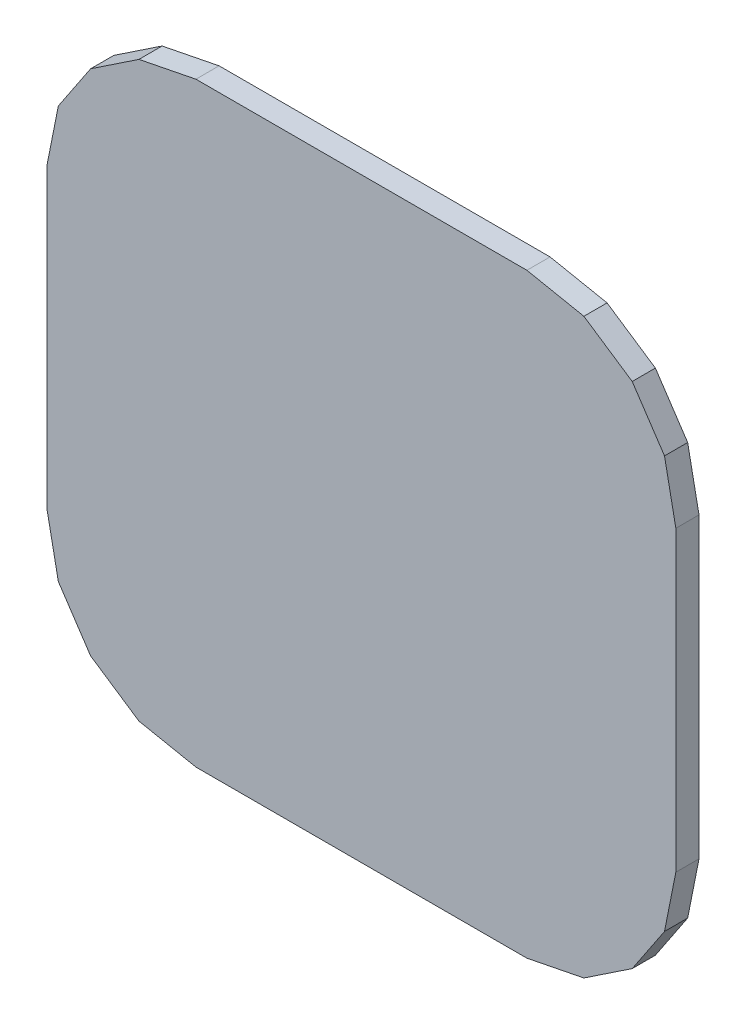
ISO-10303-21;
HEADER;
FILE_DESCRIPTION(('STEP AP214'),'2;1');
FILE_NAME('part.step','',(''),(''),'','','');
FILE_SCHEMA(('AUTOMOTIVE_DESIGN { 1 0 10303 214 1 1 1 1 }'));
ENDSEC;
DATA;
#1=APPLICATION_CONTEXT('core data for automotive mechanical design processes');
#2=APPLICATION_PROTOCOL_DEFINITION('international standard','automotive_design',2000,#1);
#3=PRODUCT_CONTEXT('',#1,'mechanical');
#4=PRODUCT('Part','Part','',(#3));
#5=PRODUCT_RELATED_PRODUCT_CATEGORY('part','',(#4));
#6=PRODUCT_DEFINITION_FORMATION('','',#4);
#7=PRODUCT_DEFINITION_CONTEXT('part definition',#1,'design');
#8=PRODUCT_DEFINITION('design','',#6,#7);
#9=PRODUCT_DEFINITION_SHAPE('','',#8);
#10=(LENGTH_UNIT() NAMED_UNIT(*) SI_UNIT(.MILLI.,.METRE.));
#11=(NAMED_UNIT(*) PLANE_ANGLE_UNIT() SI_UNIT($,.RADIAN.));
#12=(NAMED_UNIT(*) SI_UNIT($,.STERADIAN.) SOLID_ANGLE_UNIT());
#13=UNCERTAINTY_MEASURE_WITH_UNIT(LENGTH_MEASURE(1.E-05),#10,'distance_accuracy_value','');
#14=(GEOMETRIC_REPRESENTATION_CONTEXT(3) GLOBAL_UNCERTAINTY_ASSIGNED_CONTEXT((#13)) GLOBAL_UNIT_ASSIGNED_CONTEXT((#10,
#11,#12)) REPRESENTATION_CONTEXT('',''));
#15=CARTESIAN_POINT('',(0.,0.,0.));
#16=DIRECTION('',(0.,0.,1.));
#17=DIRECTION('',(1.,0.,0.));
#18=AXIS2_PLACEMENT_3D('',#15,#16,#17);
#19=CARTESIAN_POINT('',(103.855,-98.032,1.635));
#20=DIRECTION('',(0.,0.,-1.));
#21=DIRECTION('',(0.,-1.,0.));
#22=AXIS2_PLACEMENT_3D('',#19,#20,#21);
#23=PLANE('',#22);
#24=DIRECTION('',(0.980785608377497,-0.1950886731709,0.));
#25=VECTOR('',#24,1.);
#26=CARTESIAN_POINT('',(104.105,-97.582,1.635));
#27=LINE('',#26,#25);
#28=CARTESIAN_POINT('',(104.105,-97.582,1.635));
#29=VERTEX_POINT('',#28);
#30=CARTESIAN_POINT('',(104.191104,-97.599127,1.635));
#31=VERTEX_POINT('',#30);
#32=EDGE_CURVE('E20',#29,#31,#27,.T.);
#33=ORIENTED_EDGE('',*,*,#32,.F.);
#34=DIRECTION('',(1.,0.,0.));
#35=VECTOR('',#34,1.);
#36=CARTESIAN_POINT('',(103.605,-97.582,1.635));
#37=LINE('',#36,#35);
#38=CARTESIAN_POINT('',(103.605,-97.582,1.635));
#39=VERTEX_POINT('',#38);
#40=EDGE_CURVE('E351',#39,#29,#37,.T.);
#41=ORIENTED_EDGE('',*,*,#40,.F.);
#42=DIRECTION('',(0.980785608377497,0.1950886731709,0.));
#43=VECTOR('',#42,1.);
#44=CARTESIAN_POINT('',(103.518896,-97.599127,1.635));
#45=LINE('',#44,#43);
#46=CARTESIAN_POINT('',(103.518896,-97.599127,1.635));
#47=VERTEX_POINT('',#46);
#48=EDGE_CURVE('E263',#47,#39,#45,.T.);
#49=ORIENTED_EDGE('',*,*,#48,.F.);
#50=DIRECTION('',(0.831468032036157,0.555572598048105,0.));
#51=VECTOR('',#50,1.);
#52=CARTESIAN_POINT('',(103.445901,-97.647901,1.635));
#53=LINE('',#52,#51);
#54=CARTESIAN_POINT('',(103.445901,-97.647901,1.635));
#55=VERTEX_POINT('',#54);
#56=EDGE_CURVE('E338',#55,#47,#53,.T.);
#57=ORIENTED_EDGE('',*,*,#56,.F.);
#58=DIRECTION('',(0.555572598048105,0.831468032036157,0.));
#59=VECTOR('',#58,1.);
#60=CARTESIAN_POINT('',(103.397127,-97.720896,1.635));
#61=LINE('',#60,#59);
#62=CARTESIAN_POINT('',(103.397127,-97.720896,1.635));
#63=VERTEX_POINT('',#62);
#64=EDGE_CURVE('E285',#63,#55,#61,.T.);
#65=ORIENTED_EDGE('',*,*,#64,.F.);
#66=DIRECTION('',(0.1950886731709,0.980785608377497,0.));
#67=VECTOR('',#66,1.);
#68=CARTESIAN_POINT('',(103.38,-97.807,1.635));
#69=LINE('',#68,#67);
#70=CARTESIAN_POINT('',(103.38,-97.807,1.635));
#71=VERTEX_POINT('',#70);
#72=EDGE_CURVE('E326',#71,#63,#69,.T.);
#73=ORIENTED_EDGE('',*,*,#72,.F.);
#74=DIRECTION('',(0.,1.,0.));
#75=VECTOR('',#74,1.);
#76=CARTESIAN_POINT('',(103.38,-98.257,1.635));
#77=LINE('',#76,#75);
#78=CARTESIAN_POINT('',(103.38,-98.257,1.635));
#79=VERTEX_POINT('',#78);
#80=EDGE_CURVE('E311',#79,#71,#77,.T.);
#81=ORIENTED_EDGE('',*,*,#80,.F.);
#82=DIRECTION('',(-0.1950886731709,0.980785608377497,0.));
#83=VECTOR('',#82,1.);
#84=CARTESIAN_POINT('',(103.397127,-98.343104,1.635));
#85=LINE('',#84,#83);
#86=CARTESIAN_POINT('',(103.397127,-98.343104,1.635));
#87=VERTEX_POINT('',#86);
#88=EDGE_CURVE('E306',#87,#79,#85,.T.);
#89=ORIENTED_EDGE('',*,*,#88,.F.);
#90=DIRECTION('',(-0.555572598048105,0.831468032036157,0.));
#91=VECTOR('',#90,1.);
#92=CARTESIAN_POINT('',(103.445901,-98.416099,1.635));
#93=LINE('',#92,#91);
#94=CARTESIAN_POINT('',(103.445901,-98.416099,1.635));
#95=VERTEX_POINT('',#94);
#96=EDGE_CURVE('E294',#95,#87,#93,.T.);
#97=ORIENTED_EDGE('',*,*,#96,.F.);
#98=DIRECTION('',(-0.831468032036157,0.555572598048105,0.));
#99=VECTOR('',#98,1.);
#100=CARTESIAN_POINT('',(103.518896,-98.464873,1.635));
#101=LINE('',#100,#99);
#102=CARTESIAN_POINT('',(103.518896,-98.464873,1.635));
#103=VERTEX_POINT('',#102);
#104=EDGE_CURVE('E276',#103,#95,#101,.T.);
#105=ORIENTED_EDGE('',*,*,#104,.F.);
#106=DIRECTION('',(-0.980785608377497,0.1950886731709,0.));
#107=VECTOR('',#106,1.);
#108=CARTESIAN_POINT('',(103.605,-98.482,1.635));
#109=LINE('',#108,#107);
#110=CARTESIAN_POINT('',(103.605,-98.482,1.635));
#111=VERTEX_POINT('',#110);
#112=EDGE_CURVE('E267',#111,#103,#109,.T.);
#113=ORIENTED_EDGE('',*,*,#112,.F.);
#114=DIRECTION('',(-1.,0.,0.));
#115=VECTOR('',#114,1.);
#116=CARTESIAN_POINT('',(104.105,-98.482,1.635));
#117=LINE('',#116,#115);
#118=CARTESIAN_POINT('',(104.105,-98.482,1.635));
#119=VERTEX_POINT('',#118);
#120=EDGE_CURVE('E249',#119,#111,#117,.T.);
#121=ORIENTED_EDGE('',*,*,#120,.F.);
#122=DIRECTION('',(-0.980785608377497,-0.1950886731709,0.));
#123=VECTOR('',#122,1.);
#124=CARTESIAN_POINT('',(104.191104,-98.464873,1.635));
#125=LINE('',#124,#123);
#126=CARTESIAN_POINT('',(104.191104,-98.464873,1.635));
#127=VERTEX_POINT('',#126);
#128=EDGE_CURVE('E202',#127,#119,#125,.T.);
#129=ORIENTED_EDGE('',*,*,#128,.F.);
#130=DIRECTION('',(-0.831468032036157,-0.555572598048105,0.));
#131=VECTOR('',#130,1.);
#132=CARTESIAN_POINT('',(104.264099,-98.416099,1.635));
#133=LINE('',#132,#131);
#134=CARTESIAN_POINT('',(104.264099,-98.416099,1.635));
#135=VERTEX_POINT('',#134);
#136=EDGE_CURVE('E196',#135,#127,#133,.T.);
#137=ORIENTED_EDGE('',*,*,#136,.F.);
#138=DIRECTION('',(-0.555572598048105,-0.831468032036157,0.));
#139=VECTOR('',#138,1.);
#140=CARTESIAN_POINT('',(104.312873,-98.343104,1.635));
#141=LINE('',#140,#139);
#142=CARTESIAN_POINT('',(104.312873,-98.343104,1.635));
#143=VERTEX_POINT('',#142);
#144=EDGE_CURVE('E199',#143,#135,#141,.T.);
#145=ORIENTED_EDGE('',*,*,#144,.F.);
#146=DIRECTION('',(-0.1950886731709,-0.980785608377497,0.));
#147=VECTOR('',#146,1.);
#148=CARTESIAN_POINT('',(104.33,-98.257,1.635));
#149=LINE('',#148,#147);
#150=CARTESIAN_POINT('',(104.33,-98.257,1.635));
#151=VERTEX_POINT('',#150);
#152=EDGE_CURVE('E397',#151,#143,#149,.T.);
#153=ORIENTED_EDGE('',*,*,#152,.F.);
#154=DIRECTION('',(0.,-1.,0.));
#155=VECTOR('',#154,1.);
#156=CARTESIAN_POINT('',(104.33,-97.807,1.635));
#157=LINE('',#156,#155);
#158=CARTESIAN_POINT('',(104.33,-97.807,1.635));
#159=VERTEX_POINT('',#158);
#160=EDGE_CURVE('E408',#159,#151,#157,.T.);
#161=ORIENTED_EDGE('',*,*,#160,.F.);
#162=DIRECTION('',(0.1950886731709,-0.980785608377497,0.));
#163=VECTOR('',#162,1.);
#164=CARTESIAN_POINT('',(104.312873,-97.720896,1.635));
#165=LINE('',#164,#163);
#166=CARTESIAN_POINT('',(104.312873,-97.720896,1.635));
#167=VERTEX_POINT('',#166);
#168=EDGE_CURVE('E417',#167,#159,#165,.T.);
#169=ORIENTED_EDGE('',*,*,#168,.F.);
#170=DIRECTION('',(0.555572598048105,-0.831468032036157,0.));
#171=VECTOR('',#170,1.);
#172=CARTESIAN_POINT('',(104.264099,-97.647901,1.635));
#173=LINE('',#172,#171);
#174=CARTESIAN_POINT('',(104.264099,-97.647901,1.635));
#175=VERTEX_POINT('',#174);
#176=EDGE_CURVE('E370',#175,#167,#173,.T.);
#177=ORIENTED_EDGE('',*,*,#176,.F.);
#178=DIRECTION('',(0.831468032036157,-0.555572598048105,0.));
#179=VECTOR('',#178,1.);
#180=CARTESIAN_POINT('',(104.191104,-97.599127,1.635));
#181=LINE('',#180,#179);
#182=EDGE_CURVE('E368',#31,#175,#181,.T.);
#183=ORIENTED_EDGE('',*,*,#182,.F.);
#184=EDGE_LOOP('',(#33,#41,#49,#57,#65,#73,#81,#89,#97,#105,#113,#121,#129,#137,#145,#153,#161,
#169,#177,#183));
#185=FACE_BOUND('',#184,.T.);
#186=ADVANCED_FACE('F17',(#185),#23,.F.);
#187=CARTESIAN_POINT('',(103.855,-98.032,1.6));
#188=DIRECTION('',(0.,0.,-1.));
#189=DIRECTION('',(0.,-1.,0.));
#190=AXIS2_PLACEMENT_3D('',#187,#188,#189);
#191=PLANE('',#190);
#192=DIRECTION('',(0.831468032036157,-0.555572598048105,0.));
#193=VECTOR('',#192,1.);
#194=CARTESIAN_POINT('',(104.191104,-97.599127,1.6));
#195=LINE('',#194,#193);
#196=CARTESIAN_POINT('',(104.191104,-97.599127,1.6));
#197=VERTEX_POINT('',#196);
#198=CARTESIAN_POINT('',(104.264099,-97.647901,1.6));
#199=VERTEX_POINT('',#198);
#200=EDGE_CURVE('E380',#197,#199,#195,.T.);
#201=ORIENTED_EDGE('',*,*,#200,.T.);
#202=DIRECTION('',(0.555572598048105,-0.831468032036157,0.));
#203=VECTOR('',#202,1.);
#204=CARTESIAN_POINT('',(104.264099,-97.647901,1.6));
#205=LINE('',#204,#203);
#206=CARTESIAN_POINT('',(104.312873,-97.720896,1.6));
#207=VERTEX_POINT('',#206);
#208=EDGE_CURVE('E392',#199,#207,#205,.T.);
#209=ORIENTED_EDGE('',*,*,#208,.T.);
#210=DIRECTION('',(0.1950886731709,-0.980785608377497,0.));
#211=VECTOR('',#210,1.);
#212=CARTESIAN_POINT('',(104.312873,-97.720896,1.6));
#213=LINE('',#212,#211);
#214=CARTESIAN_POINT('',(104.33,-97.807,1.6));
#215=VERTEX_POINT('',#214);
#216=EDGE_CURVE('E412',#207,#215,#213,.T.);
#217=ORIENTED_EDGE('',*,*,#216,.T.);
#218=DIRECTION('',(0.,-1.,0.));
#219=VECTOR('',#218,1.);
#220=CARTESIAN_POINT('',(104.33,-97.807,1.6));
#221=LINE('',#220,#219);
#222=CARTESIAN_POINT('',(104.33,-98.257,1.6));
#223=VERTEX_POINT('',#222);
#224=EDGE_CURVE('E400',#215,#223,#221,.T.);
#225=ORIENTED_EDGE('',*,*,#224,.T.);
#226=DIRECTION('',(-0.1950886731709,-0.980785608377497,0.));
#227=VECTOR('',#226,1.);
#228=CARTESIAN_POINT('',(104.33,-98.257,1.6));
#229=LINE('',#228,#227);
#230=CARTESIAN_POINT('',(104.312873,-98.343104,1.6));
#231=VERTEX_POINT('',#230);
#232=EDGE_CURVE('E224',#223,#231,#229,.T.);
#233=ORIENTED_EDGE('',*,*,#232,.T.);
#234=DIRECTION('',(-0.555572598048105,-0.831468032036157,0.));
#235=VECTOR('',#234,1.);
#236=CARTESIAN_POINT('',(104.312873,-98.343104,1.6));
#237=LINE('',#236,#235);
#238=CARTESIAN_POINT('',(104.264099,-98.416099,1.6));
#239=VERTEX_POINT('',#238);
#240=EDGE_CURVE('E208',#231,#239,#237,.T.);
#241=ORIENTED_EDGE('',*,*,#240,.T.);
#242=DIRECTION('',(-0.831468032036157,-0.555572598048105,0.));
#243=VECTOR('',#242,1.);
#244=CARTESIAN_POINT('',(104.264099,-98.416099,1.6));
#245=LINE('',#244,#243);
#246=CARTESIAN_POINT('',(104.191104,-98.464873,1.6));
#247=VERTEX_POINT('',#246);
#248=EDGE_CURVE('E214',#239,#247,#245,.T.);
#249=ORIENTED_EDGE('',*,*,#248,.T.);
#250=DIRECTION('',(-0.980785608377497,-0.1950886731709,0.));
#251=VECTOR('',#250,1.);
#252=CARTESIAN_POINT('',(104.191104,-98.464873,1.6));
#253=LINE('',#252,#251);
#254=CARTESIAN_POINT('',(104.105,-98.482,1.6));
#255=VERTEX_POINT('',#254);
#256=EDGE_CURVE('E245',#247,#255,#253,.T.);
#257=ORIENTED_EDGE('',*,*,#256,.T.);
#258=DIRECTION('',(-1.,0.,0.));
#259=VECTOR('',#258,1.);
#260=CARTESIAN_POINT('',(104.105,-98.482,1.6));
#261=LINE('',#260,#259);
#262=CARTESIAN_POINT('',(103.605,-98.482,1.6));
#263=VERTEX_POINT('',#262);
#264=EDGE_CURVE('E257',#255,#263,#261,.T.);
#265=ORIENTED_EDGE('',*,*,#264,.T.);
#266=DIRECTION('',(-0.980785608377497,0.1950886731709,0.));
#267=VECTOR('',#266,1.);
#268=CARTESIAN_POINT('',(103.605,-98.482,1.6));
#269=LINE('',#268,#267);
#270=CARTESIAN_POINT('',(103.518896,-98.464873,1.6));
#271=VERTEX_POINT('',#270);
#272=EDGE_CURVE('E275',#263,#271,#269,.T.);
#273=ORIENTED_EDGE('',*,*,#272,.T.);
#274=DIRECTION('',(-0.831468032036157,0.555572598048105,0.));
#275=VECTOR('',#274,1.);
#276=CARTESIAN_POINT('',(103.518896,-98.464873,1.6));
#277=LINE('',#276,#275);
#278=CARTESIAN_POINT('',(103.445901,-98.416099,1.6));
#279=VERTEX_POINT('',#278);
#280=EDGE_CURVE('E289',#271,#279,#277,.T.);
#281=ORIENTED_EDGE('',*,*,#280,.T.);
#282=DIRECTION('',(-0.555572598048105,0.831468032036157,0.));
#283=VECTOR('',#282,1.);
#284=CARTESIAN_POINT('',(103.445901,-98.416099,1.6));
#285=LINE('',#284,#283);
#286=CARTESIAN_POINT('',(103.397127,-98.343104,1.6));
#287=VERTEX_POINT('',#286);
#288=EDGE_CURVE('E302',#279,#287,#285,.T.);
#289=ORIENTED_EDGE('',*,*,#288,.T.);
#290=DIRECTION('',(-0.1950886731709,0.980785608377497,0.));
#291=VECTOR('',#290,1.);
#292=CARTESIAN_POINT('',(103.397127,-98.343104,1.6));
#293=LINE('',#292,#291);
#294=CARTESIAN_POINT('',(103.38,-98.257,1.6));
#295=VERTEX_POINT('',#294);
#296=EDGE_CURVE('E307',#287,#295,#293,.T.);
#297=ORIENTED_EDGE('',*,*,#296,.T.);
#298=DIRECTION('',(0.,1.,0.));
#299=VECTOR('',#298,1.);
#300=CARTESIAN_POINT('',(103.38,-98.257,1.6));
#301=LINE('',#300,#299);
#302=CARTESIAN_POINT('',(103.38,-97.807,1.6));
#303=VERTEX_POINT('',#302);
#304=EDGE_CURVE('E317',#295,#303,#301,.T.);
#305=ORIENTED_EDGE('',*,*,#304,.T.);
#306=DIRECTION('',(0.1950886731709,0.980785608377497,0.));
#307=VECTOR('',#306,1.);
#308=CARTESIAN_POINT('',(103.38,-97.807,1.6));
#309=LINE('',#308,#307);
#310=CARTESIAN_POINT('',(103.397127,-97.720896,1.6));
#311=VERTEX_POINT('',#310);
#312=EDGE_CURVE('E281',#303,#311,#309,.T.);
#313=ORIENTED_EDGE('',*,*,#312,.T.);
#314=DIRECTION('',(0.555572598048105,0.831468032036157,0.));
#315=VECTOR('',#314,1.);
#316=CARTESIAN_POINT('',(103.397127,-97.720896,1.6));
#317=LINE('',#316,#315);
#318=CARTESIAN_POINT('',(103.445901,-97.647901,1.6));
#319=VERTEX_POINT('',#318);
#320=EDGE_CURVE('E334',#311,#319,#317,.T.);
#321=ORIENTED_EDGE('',*,*,#320,.T.);
#322=DIRECTION('',(0.831468032036157,0.555572598048105,0.));
#323=VECTOR('',#322,1.);
#324=CARTESIAN_POINT('',(103.445901,-97.647901,1.6));
#325=LINE('',#324,#323);
#326=CARTESIAN_POINT('',(103.518896,-97.599127,1.6));
#327=VERTEX_POINT('',#326);
#328=EDGE_CURVE('E318',#319,#327,#325,.T.);
#329=ORIENTED_EDGE('',*,*,#328,.T.);
#330=DIRECTION('',(0.980785608377497,0.1950886731709,0.));
#331=VECTOR('',#330,1.);
#332=CARTESIAN_POINT('',(103.518896,-97.599127,1.6));
#333=LINE('',#332,#331);
#334=CARTESIAN_POINT('',(103.605,-97.582,1.6));
#335=VERTEX_POINT('',#334);
#336=EDGE_CURVE('E262',#327,#335,#333,.T.);
#337=ORIENTED_EDGE('',*,*,#336,.T.);
#338=DIRECTION('',(1.,0.,0.));
#339=VECTOR('',#338,1.);
#340=CARTESIAN_POINT('',(103.605,-97.582,1.6));
#341=LINE('',#340,#339);
#342=CARTESIAN_POINT('',(104.105,-97.582,1.6));
#343=VERTEX_POINT('',#342);
#344=EDGE_CURVE('E354',#335,#343,#341,.T.);
#345=ORIENTED_EDGE('',*,*,#344,.T.);
#346=DIRECTION('',(0.980785608377497,-0.1950886731709,0.));
#347=VECTOR('',#346,1.);
#348=CARTESIAN_POINT('',(104.105,-97.582,1.6));
#349=LINE('',#348,#347);
#350=EDGE_CURVE('E11',#343,#197,#349,.T.);
#351=ORIENTED_EDGE('',*,*,#350,.T.);
#352=EDGE_LOOP('',(#201,#209,#217,#225,#233,#241,#249,#257,#265,#273,#281,#289,#297,#305,#313,
#321,#329,#337,#345,#351));
#353=FACE_BOUND('',#352,.T.);
#354=ADVANCED_FACE('F460',(#353),#191,.T.);
#355=CARTESIAN_POINT('',(104.105,-97.582,1.6));
#356=DIRECTION('',(0.1950886731709,0.980785608377497,0.));
#357=DIRECTION('',(0.,0.,-1.));
#358=AXIS2_PLACEMENT_3D('',#355,#356,#357);
#359=PLANE('',#358);
#360=DIRECTION('',(0.,0.,1.));
#361=VECTOR('',#360,1.);
#362=CARTESIAN_POINT('',(104.105,-97.582,1.6));
#363=LINE('',#362,#361);
#364=EDGE_CURVE('E352',#343,#29,#363,.T.);
#365=ORIENTED_EDGE('',*,*,#364,.T.);
#366=ORIENTED_EDGE('',*,*,#32,.T.);
#367=DIRECTION('',(0.,0.,1.));
#368=VECTOR('',#367,1.);
#369=CARTESIAN_POINT('',(104.191104,-97.599127,1.6));
#370=LINE('',#369,#368);
#371=EDGE_CURVE('E365',#197,#31,#370,.T.);
#372=ORIENTED_EDGE('',*,*,#371,.F.);
#373=ORIENTED_EDGE('',*,*,#350,.F.);
#374=EDGE_LOOP('',(#365,#366,#372,#373));
#375=FACE_BOUND('',#374,.T.);
#376=ADVANCED_FACE('F363',(#375),#359,.T.);
#377=CARTESIAN_POINT('',(103.605,-97.582,1.6));
#378=DIRECTION('',(0.,1.,0.));
#379=DIRECTION('',(1.,0.,0.));
#380=AXIS2_PLACEMENT_3D('',#377,#378,#379);
#381=PLANE('',#380);
#382=DIRECTION('',(0.,0.,1.));
#383=VECTOR('',#382,1.);
#384=CARTESIAN_POINT('',(103.605,-97.582,1.6));
#385=LINE('',#384,#383);
#386=EDGE_CURVE('E258',#335,#39,#385,.T.);
#387=ORIENTED_EDGE('',*,*,#386,.T.);
#388=ORIENTED_EDGE('',*,*,#40,.T.);
#389=ORIENTED_EDGE('',*,*,#364,.F.);
#390=ORIENTED_EDGE('',*,*,#344,.F.);
#391=EDGE_LOOP('',(#387,#388,#389,#390));
#392=FACE_BOUND('',#391,.T.);
#393=ADVANCED_FACE('F507',(#392),#381,.T.);
#394=CARTESIAN_POINT('',(103.518896,-97.599127,1.6));
#395=DIRECTION('',(-0.1950886731709,0.980785608377497,0.));
#396=DIRECTION('',(0.,0.,1.));
#397=AXIS2_PLACEMENT_3D('',#394,#395,#396);
#398=PLANE('',#397);
#399=DIRECTION('',(0.,0.,1.));
#400=VECTOR('',#399,1.);
#401=CARTESIAN_POINT('',(103.518896,-97.599127,1.6));
#402=LINE('',#401,#400);
#403=EDGE_CURVE('E322',#327,#47,#402,.T.);
#404=ORIENTED_EDGE('',*,*,#403,.T.);
#405=ORIENTED_EDGE('',*,*,#48,.T.);
#406=ORIENTED_EDGE('',*,*,#386,.F.);
#407=ORIENTED_EDGE('',*,*,#336,.F.);
#408=EDGE_LOOP('',(#404,#405,#406,#407));
#409=FACE_BOUND('',#408,.T.);
#410=ADVANCED_FACE('F512',(#409),#398,.T.);
#411=CARTESIAN_POINT('',(103.445901,-97.647901,1.6));
#412=DIRECTION('',(-0.555572598048105,0.831468032036157,0.));
#413=DIRECTION('',(0.,0.,1.));
#414=AXIS2_PLACEMENT_3D('',#411,#412,#413);
#415=PLANE('',#414);
#416=DIRECTION('',(0.,0.,1.));
#417=VECTOR('',#416,1.);
#418=CARTESIAN_POINT('',(103.445901,-97.647901,1.6));
#419=LINE('',#418,#417);
#420=EDGE_CURVE('E330',#319,#55,#419,.T.);
#421=ORIENTED_EDGE('',*,*,#420,.T.);
#422=ORIENTED_EDGE('',*,*,#56,.T.);
#423=ORIENTED_EDGE('',*,*,#403,.F.);
#424=ORIENTED_EDGE('',*,*,#328,.F.);
#425=EDGE_LOOP('',(#421,#422,#423,#424));
#426=FACE_BOUND('',#425,.T.);
#427=ADVANCED_FACE('F516',(#426),#415,.T.);
#428=CARTESIAN_POINT('',(103.397127,-97.720896,1.6));
#429=DIRECTION('',(-0.831468032036157,0.555572598048105,0.));
#430=DIRECTION('',(0.,0.,1.));
#431=AXIS2_PLACEMENT_3D('',#428,#429,#430);
#432=PLANE('',#431);
#433=DIRECTION('',(0.,0.,1.));
#434=VECTOR('',#433,1.);
#435=CARTESIAN_POINT('',(103.397127,-97.720896,1.6));
#436=LINE('',#435,#434);
#437=EDGE_CURVE('E286',#311,#63,#436,.T.);
#438=ORIENTED_EDGE('',*,*,#437,.T.);
#439=ORIENTED_EDGE('',*,*,#64,.T.);
#440=ORIENTED_EDGE('',*,*,#420,.F.);
#441=ORIENTED_EDGE('',*,*,#320,.F.);
#442=EDGE_LOOP('',(#438,#439,#440,#441));
#443=FACE_BOUND('',#442,.T.);
#444=ADVANCED_FACE('F520',(#443),#432,.T.);
#445=CARTESIAN_POINT('',(103.38,-97.807,1.6));
#446=DIRECTION('',(-0.980785608377497,0.1950886731709,0.));
#447=DIRECTION('',(0.,0.,1.));
#448=AXIS2_PLACEMENT_3D('',#445,#446,#447);
#449=PLANE('',#448);
#450=DIRECTION('',(0.,0.,1.));
#451=VECTOR('',#450,1.);
#452=CARTESIAN_POINT('',(103.38,-97.807,1.6));
#453=LINE('',#452,#451);
#454=EDGE_CURVE('E313',#303,#71,#453,.T.);
#455=ORIENTED_EDGE('',*,*,#454,.T.);
#456=ORIENTED_EDGE('',*,*,#72,.T.);
#457=ORIENTED_EDGE('',*,*,#437,.F.);
#458=ORIENTED_EDGE('',*,*,#312,.F.);
#459=EDGE_LOOP('',(#455,#456,#457,#458));
#460=FACE_BOUND('',#459,.T.);
#461=ADVANCED_FACE('F459',(#460),#449,.T.);
#462=CARTESIAN_POINT('',(103.38,-98.257,1.6));
#463=DIRECTION('',(-1.,0.,0.));
#464=DIRECTION('',(0.,0.,1.));
#465=AXIS2_PLACEMENT_3D('',#462,#463,#464);
#466=PLANE('',#465);
#467=DIRECTION('',(0.,0.,1.));
#468=VECTOR('',#467,1.);
#469=CARTESIAN_POINT('',(103.38,-98.257,1.6));
#470=LINE('',#469,#468);
#471=EDGE_CURVE('E312',#295,#79,#470,.T.);
#472=ORIENTED_EDGE('',*,*,#471,.T.);
#473=ORIENTED_EDGE('',*,*,#80,.T.);
#474=ORIENTED_EDGE('',*,*,#454,.F.);
#475=ORIENTED_EDGE('',*,*,#304,.F.);
#476=EDGE_LOOP('',(#472,#473,#474,#475));
#477=FACE_BOUND('',#476,.T.);
#478=ADVANCED_FACE('F452',(#477),#466,.T.);
#479=CARTESIAN_POINT('',(103.397127,-98.343104,1.6));
#480=DIRECTION('',(-0.980785608377497,-0.1950886731709,0.));
#481=DIRECTION('',(-0.1950886731709,0.980785608377497,0.));
#482=AXIS2_PLACEMENT_3D('',#479,#480,#481);
#483=PLANE('',#482);
#484=DIRECTION('',(0.,0.,1.));
#485=VECTOR('',#484,1.);
#486=CARTESIAN_POINT('',(103.397127,-98.343104,1.6));
#487=LINE('',#486,#485);
#488=EDGE_CURVE('E298',#287,#87,#487,.T.);
#489=ORIENTED_EDGE('',*,*,#488,.T.);
#490=ORIENTED_EDGE('',*,*,#88,.T.);
#491=ORIENTED_EDGE('',*,*,#471,.F.);
#492=ORIENTED_EDGE('',*,*,#296,.F.);
#493=EDGE_LOOP('',(#489,#490,#491,#492));
#494=FACE_BOUND('',#493,.T.);
#495=ADVANCED_FACE('F455',(#494),#483,.T.);
#496=CARTESIAN_POINT('',(103.445901,-98.416099,1.6));
#497=DIRECTION('',(-0.831468032036157,-0.555572598048105,0.));
#498=DIRECTION('',(-0.555572598048105,0.831468032036157,0.));
#499=AXIS2_PLACEMENT_3D('',#496,#497,#498);
#500=PLANE('',#499);
#501=DIRECTION('',(0.,0.,1.));
#502=VECTOR('',#501,1.);
#503=CARTESIAN_POINT('',(103.445901,-98.416099,1.6));
#504=LINE('',#503,#502);
#505=EDGE_CURVE('E280',#279,#95,#504,.T.);
#506=ORIENTED_EDGE('',*,*,#505,.T.);
#507=ORIENTED_EDGE('',*,*,#96,.T.);
#508=ORIENTED_EDGE('',*,*,#488,.F.);
#509=ORIENTED_EDGE('',*,*,#288,.F.);
#510=EDGE_LOOP('',(#506,#507,#508,#509));
#511=FACE_BOUND('',#510,.T.);
#512=ADVANCED_FACE('F463',(#511),#500,.T.);
#513=CARTESIAN_POINT('',(103.518896,-98.464873,1.6));
#514=DIRECTION('',(-0.555572598048105,-0.831468032036157,0.));
#515=DIRECTION('',(-0.831468032036157,0.555572598048105,0.));
#516=AXIS2_PLACEMENT_3D('',#513,#514,#515);
#517=PLANE('',#516);
#518=DIRECTION('',(0.,0.,1.));
#519=VECTOR('',#518,1.);
#520=CARTESIAN_POINT('',(103.518896,-98.464873,1.6));
#521=LINE('',#520,#519);
#522=EDGE_CURVE('E271',#271,#103,#521,.T.);
#523=ORIENTED_EDGE('',*,*,#522,.T.);
#524=ORIENTED_EDGE('',*,*,#104,.T.);
#525=ORIENTED_EDGE('',*,*,#505,.F.);
#526=ORIENTED_EDGE('',*,*,#280,.F.);
#527=EDGE_LOOP('',(#523,#524,#525,#526));
#528=FACE_BOUND('',#527,.T.);
#529=ADVANCED_FACE('F465',(#528),#517,.T.);
#530=CARTESIAN_POINT('',(103.605,-98.482,1.6));
#531=DIRECTION('',(-0.1950886731709,-0.980785608377497,0.));
#532=DIRECTION('',(-0.980785608377497,0.1950886731709,0.));
#533=AXIS2_PLACEMENT_3D('',#530,#531,#532);
#534=PLANE('',#533);
#535=DIRECTION('',(0.,0.,1.));
#536=VECTOR('',#535,1.);
#537=CARTESIAN_POINT('',(103.605,-98.482,1.6));
#538=LINE('',#537,#536);
#539=EDGE_CURVE('E253',#263,#111,#538,.T.);
#540=ORIENTED_EDGE('',*,*,#539,.T.);
#541=ORIENTED_EDGE('',*,*,#112,.T.);
#542=ORIENTED_EDGE('',*,*,#522,.F.);
#543=ORIENTED_EDGE('',*,*,#272,.F.);
#544=EDGE_LOOP('',(#540,#541,#542,#543));
#545=FACE_BOUND('',#544,.T.);
#546=ADVANCED_FACE('F469',(#545),#534,.T.);
#547=CARTESIAN_POINT('',(104.105,-98.482,1.6));
#548=DIRECTION('',(0.,-1.,0.));
#549=DIRECTION('',(0.,0.,-1.));
#550=AXIS2_PLACEMENT_3D('',#547,#548,#549);
#551=PLANE('',#550);
#552=DIRECTION('',(0.,0.,1.));
#553=VECTOR('',#552,1.);
#554=CARTESIAN_POINT('',(104.105,-98.482,1.6));
#555=LINE('',#554,#553);
#556=EDGE_CURVE('E241',#255,#119,#555,.T.);
#557=ORIENTED_EDGE('',*,*,#556,.T.);
#558=ORIENTED_EDGE('',*,*,#120,.T.);
#559=ORIENTED_EDGE('',*,*,#539,.F.);
#560=ORIENTED_EDGE('',*,*,#264,.F.);
#561=EDGE_LOOP('',(#557,#558,#559,#560));
#562=FACE_BOUND('',#561,.T.);
#563=ADVANCED_FACE('F471',(#562),#551,.T.);
#564=CARTESIAN_POINT('',(104.191104,-98.464873,1.6));
#565=DIRECTION('',(0.1950886731709,-0.980785608377497,0.));
#566=DIRECTION('',(0.,0.,-1.));
#567=AXIS2_PLACEMENT_3D('',#564,#565,#566);
#568=PLANE('',#567);
#569=DIRECTION('',(0.,0.,1.));
#570=VECTOR('',#569,1.);
#571=CARTESIAN_POINT('',(104.191104,-98.464873,1.6));
#572=LINE('',#571,#570);
#573=EDGE_CURVE('E207',#247,#127,#572,.T.);
#574=ORIENTED_EDGE('',*,*,#573,.T.);
#575=ORIENTED_EDGE('',*,*,#128,.T.);
#576=ORIENTED_EDGE('',*,*,#556,.F.);
#577=ORIENTED_EDGE('',*,*,#256,.F.);
#578=EDGE_LOOP('',(#574,#575,#576,#577));
#579=FACE_BOUND('',#578,.T.);
#580=ADVANCED_FACE('F474',(#579),#568,.T.);
#581=CARTESIAN_POINT('',(104.264099,-98.416099,1.6));
#582=DIRECTION('',(0.555572598048105,-0.831468032036157,0.));
#583=DIRECTION('',(0.,0.,-1.));
#584=AXIS2_PLACEMENT_3D('',#581,#582,#583);
#585=PLANE('',#584);
#586=DIRECTION('',(0.,0.,1.));
#587=VECTOR('',#586,1.);
#588=CARTESIAN_POINT('',(104.264099,-98.416099,1.6));
#589=LINE('',#588,#587);
#590=EDGE_CURVE('E211',#239,#135,#589,.T.);
#591=ORIENTED_EDGE('',*,*,#590,.T.);
#592=ORIENTED_EDGE('',*,*,#136,.T.);
#593=ORIENTED_EDGE('',*,*,#573,.F.);
#594=ORIENTED_EDGE('',*,*,#248,.F.);
#595=EDGE_LOOP('',(#591,#592,#593,#594));
#596=FACE_BOUND('',#595,.T.);
#597=ADVANCED_FACE('F212',(#596),#585,.T.);
#598=CARTESIAN_POINT('',(104.312873,-98.343104,1.6));
#599=DIRECTION('',(0.831468032036157,-0.555572598048105,0.));
#600=DIRECTION('',(0.,0.,-1.));
#601=AXIS2_PLACEMENT_3D('',#598,#599,#600);
#602=PLANE('',#601);
#603=DIRECTION('',(0.,0.,1.));
#604=VECTOR('',#603,1.);
#605=CARTESIAN_POINT('',(104.312873,-98.343104,1.6));
#606=LINE('',#605,#604);
#607=EDGE_CURVE('E221',#231,#143,#606,.T.);
#608=ORIENTED_EDGE('',*,*,#607,.T.);
#609=ORIENTED_EDGE('',*,*,#144,.T.);
#610=ORIENTED_EDGE('',*,*,#590,.F.);
#611=ORIENTED_EDGE('',*,*,#240,.F.);
#612=EDGE_LOOP('',(#608,#609,#610,#611));
#613=FACE_BOUND('',#612,.T.);
#614=ADVANCED_FACE('F219',(#613),#602,.T.);
#615=CARTESIAN_POINT('',(104.33,-98.257,1.6));
#616=DIRECTION('',(0.980785608377497,-0.1950886731709,0.));
#617=DIRECTION('',(0.,0.,-1.));
#618=AXIS2_PLACEMENT_3D('',#615,#616,#617);
#619=PLANE('',#618);
#620=DIRECTION('',(0.,0.,1.));
#621=VECTOR('',#620,1.);
#622=CARTESIAN_POINT('',(104.33,-98.257,1.6));
#623=LINE('',#622,#621);
#624=EDGE_CURVE('E404',#223,#151,#623,.T.);
#625=ORIENTED_EDGE('',*,*,#624,.T.);
#626=ORIENTED_EDGE('',*,*,#152,.T.);
#627=ORIENTED_EDGE('',*,*,#607,.F.);
#628=ORIENTED_EDGE('',*,*,#232,.F.);
#629=EDGE_LOOP('',(#625,#626,#627,#628));
#630=FACE_BOUND('',#629,.T.);
#631=ADVANCED_FACE('F477',(#630),#619,.T.);
#632=CARTESIAN_POINT('',(104.33,-97.807,1.6));
#633=DIRECTION('',(1.,0.,0.));
#634=DIRECTION('',(0.,1.,0.));
#635=AXIS2_PLACEMENT_3D('',#632,#633,#634);
#636=PLANE('',#635);
#637=DIRECTION('',(0.,0.,1.));
#638=VECTOR('',#637,1.);
#639=CARTESIAN_POINT('',(104.33,-97.807,1.6));
#640=LINE('',#639,#638);
#641=EDGE_CURVE('E413',#215,#159,#640,.T.);
#642=ORIENTED_EDGE('',*,*,#641,.T.);
#643=ORIENTED_EDGE('',*,*,#160,.T.);
#644=ORIENTED_EDGE('',*,*,#624,.F.);
#645=ORIENTED_EDGE('',*,*,#224,.F.);
#646=EDGE_LOOP('',(#642,#643,#644,#645));
#647=FACE_BOUND('',#646,.T.);
#648=ADVANCED_FACE('F480',(#647),#636,.T.);
#649=CARTESIAN_POINT('',(104.312873,-97.720896,1.6));
#650=DIRECTION('',(0.980785608377497,0.1950886731709,0.));
#651=DIRECTION('',(0.,0.,-1.));
#652=AXIS2_PLACEMENT_3D('',#649,#650,#651);
#653=PLANE('',#652);
#654=DIRECTION('',(0.,0.,1.));
#655=VECTOR('',#654,1.);
#656=CARTESIAN_POINT('',(104.312873,-97.720896,1.6));
#657=LINE('',#656,#655);
#658=EDGE_CURVE('E388',#207,#167,#657,.T.);
#659=ORIENTED_EDGE('',*,*,#658,.T.);
#660=ORIENTED_EDGE('',*,*,#168,.T.);
#661=ORIENTED_EDGE('',*,*,#641,.F.);
#662=ORIENTED_EDGE('',*,*,#216,.F.);
#663=EDGE_LOOP('',(#659,#660,#661,#662));
#664=FACE_BOUND('',#663,.T.);
#665=ADVANCED_FACE('F482',(#664),#653,.T.);
#666=CARTESIAN_POINT('',(104.264099,-97.647901,1.6));
#667=DIRECTION('',(0.831468032036157,0.555572598048105,0.));
#668=DIRECTION('',(0.,0.,-1.));
#669=AXIS2_PLACEMENT_3D('',#666,#667,#668);
#670=PLANE('',#669);
#671=DIRECTION('',(0.,0.,1.));
#672=VECTOR('',#671,1.);
#673=CARTESIAN_POINT('',(104.264099,-97.647901,1.6));
#674=LINE('',#673,#672);
#675=EDGE_CURVE('E375',#199,#175,#674,.T.);
#676=ORIENTED_EDGE('',*,*,#675,.T.);
#677=ORIENTED_EDGE('',*,*,#176,.T.);
#678=ORIENTED_EDGE('',*,*,#658,.F.);
#679=ORIENTED_EDGE('',*,*,#208,.F.);
#680=EDGE_LOOP('',(#676,#677,#678,#679));
#681=FACE_BOUND('',#680,.T.);
#682=ADVANCED_FACE('F485',(#681),#670,.T.);
#683=CARTESIAN_POINT('',(104.191104,-97.599127,1.6));
#684=DIRECTION('',(0.555572598048105,0.831468032036157,0.));
#685=DIRECTION('',(0.,0.,-1.));
#686=AXIS2_PLACEMENT_3D('',#683,#684,#685);
#687=PLANE('',#686);
#688=ORIENTED_EDGE('',*,*,#371,.T.);
#689=ORIENTED_EDGE('',*,*,#182,.T.);
#690=ORIENTED_EDGE('',*,*,#675,.F.);
#691=ORIENTED_EDGE('',*,*,#200,.F.);
#692=EDGE_LOOP('',(#688,#689,#690,#691));
#693=FACE_BOUND('',#692,.T.);
#694=ADVANCED_FACE('F378',(#693),#687,.T.);
#695=CLOSED_SHELL('',(#186,#354,#376,#393,#410,#427,#444,#461,#478,#495,#512,#529,#546,#563,
#580,#597,#614,#631,#648,#665,#682,#694));
#696=MANIFOLD_SOLID_BREP('B1',#695);
#697=ADVANCED_BREP_SHAPE_REPRESENTATION('',(#18,#696),#14);
#698=SHAPE_DEFINITION_REPRESENTATION(#9,#697);
ENDSEC;
END-ISO-10303-21;
